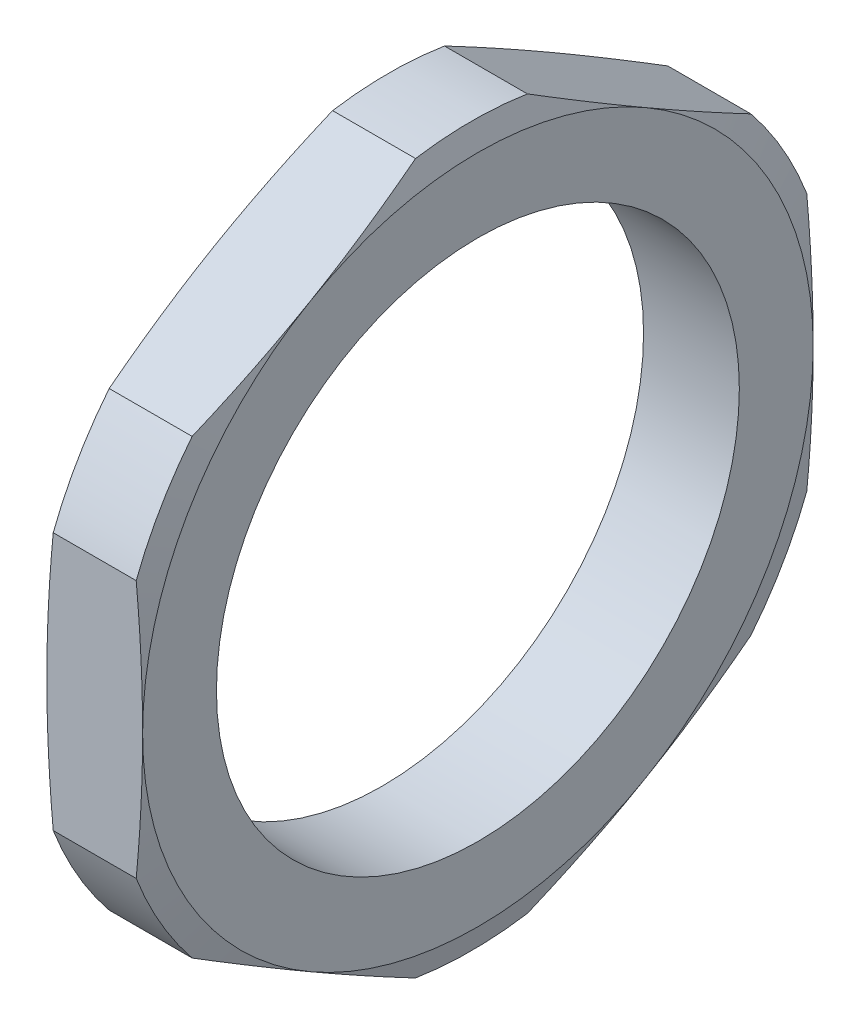
ISO-10303-21;
HEADER;
FILE_DESCRIPTION(('STEP AP214'),'2;1');
FILE_NAME('part.step','',(''),(''),'','','');
FILE_SCHEMA(('AUTOMOTIVE_DESIGN { 1 0 10303 214 1 1 1 1 }'));
ENDSEC;
DATA;
#1=APPLICATION_CONTEXT('core data for automotive mechanical design processes');
#2=APPLICATION_PROTOCOL_DEFINITION('international standard','automotive_design',2000,#1);
#3=PRODUCT_CONTEXT('',#1,'mechanical');
#4=PRODUCT('Part','Part','',(#3));
#5=PRODUCT_RELATED_PRODUCT_CATEGORY('part','',(#4));
#6=PRODUCT_DEFINITION_FORMATION('','',#4);
#7=PRODUCT_DEFINITION_CONTEXT('part definition',#1,'design');
#8=PRODUCT_DEFINITION('design','',#6,#7);
#9=PRODUCT_DEFINITION_SHAPE('','',#8);
#10=(LENGTH_UNIT() NAMED_UNIT(*) SI_UNIT(.MILLI.,.METRE.));
#11=(NAMED_UNIT(*) PLANE_ANGLE_UNIT() SI_UNIT($,.RADIAN.));
#12=(NAMED_UNIT(*) SI_UNIT($,.STERADIAN.) SOLID_ANGLE_UNIT());
#13=UNCERTAINTY_MEASURE_WITH_UNIT(LENGTH_MEASURE(1.E-05),#10,'distance_accuracy_value','');
#14=(GEOMETRIC_REPRESENTATION_CONTEXT(3) GLOBAL_UNCERTAINTY_ASSIGNED_CONTEXT((#13)) GLOBAL_UNIT_ASSIGNED_CONTEXT((#10,
#11,#12)) REPRESENTATION_CONTEXT('',''));
#15=CARTESIAN_POINT('',(0.,0.,0.));
#16=DIRECTION('',(0.,0.,1.));
#17=DIRECTION('',(1.,0.,0.));
#18=AXIS2_PLACEMENT_3D('',#15,#16,#17);
#19=CARTESIAN_POINT('',(17.5,0.,0.));
#20=DIRECTION('',(1.,0.,0.));
#21=DIRECTION('',(0.,0.,-1.));
#22=AXIS2_PLACEMENT_3D('',#19,#20,#21);
#23=CYLINDRICAL_SURFACE('',#22,7.5);
#24=DIRECTION('',(-1.,0.,0.));
#25=VECTOR('',#24,1.);
#26=CARTESIAN_POINT('',(20.5,7.40846902827469,1.16815523672779));
#27=LINE('',#26,#25);
#28=CARTESIAN_POINT('',(19.3660254037845,7.4084690282747,1.16815523672779));
#29=VERTEX_POINT('',#28);
#30=CARTESIAN_POINT('',(17.6339745962156,7.4084690282747,1.16815523672779));
#31=VERTEX_POINT('',#30);
#32=EDGE_CURVE('E42',#29,#31,#27,.T.);
#33=ORIENTED_EDGE('',*,*,#32,.F.);
#34=CARTESIAN_POINT('',(19.3660254037845,0.,0.));
#35=DIRECTION('',(-1.,0.,0.));
#36=DIRECTION('',(0.,0.,1.));
#37=AXIS2_PLACEMENT_3D('',#34,#35,#36);
#38=CIRCLE('',#37,7.5);
#39=CARTESIAN_POINT('',(19.3660254037845,7.40846902827469,-1.16815523672783));
#40=VERTEX_POINT('',#39);
#41=EDGE_CURVE('E11',#29,#40,#38,.T.);
#42=ORIENTED_EDGE('',*,*,#41,.T.);
#43=DIRECTION('',(-1.,0.,0.));
#44=VECTOR('',#43,1.);
#45=CARTESIAN_POINT('',(20.5,7.40846902827469,-1.16815523672783));
#46=LINE('',#45,#44);
#47=CARTESIAN_POINT('',(17.6339745962155,7.40846902827469,-1.16815523672783));
#48=VERTEX_POINT('',#47);
#49=EDGE_CURVE('E29',#40,#48,#46,.T.);
#50=ORIENTED_EDGE('',*,*,#49,.T.);
#51=CARTESIAN_POINT('',(17.6339745962156,0.,0.));
#52=DIRECTION('',(-1.,0.,0.));
#53=DIRECTION('',(0.,0.,1.));
#54=AXIS2_PLACEMENT_3D('',#51,#52,#53);
#55=CIRCLE('',#54,7.5);
#56=EDGE_CURVE('E123',#31,#48,#55,.T.);
#57=ORIENTED_EDGE('',*,*,#56,.F.);
#58=EDGE_LOOP('',(#33,#42,#50,#57));
#59=FACE_BOUND('',#58,.T.);
#60=ADVANCED_FACE('F16',(#59),#23,.T.);
#61=CARTESIAN_POINT('',(17.5,0.,0.));
#62=DIRECTION('',(1.,0.,0.));
#63=DIRECTION('',(0.,0.,-1.));
#64=AXIS2_PLACEMENT_3D('',#61,#62,#63);
#65=CYLINDRICAL_SURFACE('',#64,7.5);
#66=DIRECTION('',(-1.,0.,0.));
#67=VECTOR('',#66,1.);
#68=CARTESIAN_POINT('',(20.5,4.71588662470743,-5.83184476327221));
#69=LINE('',#68,#67);
#70=CARTESIAN_POINT('',(19.3660254037845,4.71588662470743,-5.83184476327221));
#71=VERTEX_POINT('',#70);
#72=CARTESIAN_POINT('',(17.6339745962156,4.71588662470743,-5.83184476327222));
#73=VERTEX_POINT('',#72);
#74=EDGE_CURVE('E136',#71,#73,#69,.T.);
#75=ORIENTED_EDGE('',*,*,#74,.F.);
#76=CARTESIAN_POINT('',(19.3660254037845,0.,0.));
#77=DIRECTION('',(-1.,0.,0.));
#78=DIRECTION('',(0.,0.,1.));
#79=AXIS2_PLACEMENT_3D('',#76,#77,#78);
#80=CIRCLE('',#79,7.5);
#81=CARTESIAN_POINT('',(19.3660254037845,2.69258240356722,-7.));
#82=VERTEX_POINT('',#81);
#83=EDGE_CURVE('E1076',#71,#82,#80,.T.);
#84=ORIENTED_EDGE('',*,*,#83,.T.);
#85=DIRECTION('',(-1.,0.,0.));
#86=VECTOR('',#85,1.);
#87=CARTESIAN_POINT('',(20.5,2.69258240356722,-7.));
#88=LINE('',#87,#86);
#89=CARTESIAN_POINT('',(17.6339745962156,2.69258240356722,-7.));
#90=VERTEX_POINT('',#89);
#91=EDGE_CURVE('E492',#82,#90,#88,.T.);
#92=ORIENTED_EDGE('',*,*,#91,.T.);
#93=CARTESIAN_POINT('',(17.6339745962156,0.,0.));
#94=DIRECTION('',(-1.,0.,0.));
#95=DIRECTION('',(0.,0.,1.));
#96=AXIS2_PLACEMENT_3D('',#93,#94,#95);
#97=CIRCLE('',#96,7.5);
#98=EDGE_CURVE('E671',#73,#90,#97,.T.);
#99=ORIENTED_EDGE('',*,*,#98,.F.);
#100=EDGE_LOOP('',(#75,#84,#92,#99));
#101=FACE_BOUND('',#100,.T.);
#102=ADVANCED_FACE('F18',(#101),#65,.T.);
#103=CARTESIAN_POINT('',(17.5,0.,0.));
#104=DIRECTION('',(1.,0.,0.));
#105=DIRECTION('',(0.,0.,-1.));
#106=AXIS2_PLACEMENT_3D('',#103,#104,#105);
#107=CYLINDRICAL_SURFACE('',#106,7.5);
#108=DIRECTION('',(-1.,0.,0.));
#109=VECTOR('',#108,1.);
#110=CARTESIAN_POINT('',(20.5,-2.69258240356726,-7.));
#111=LINE('',#110,#109);
#112=CARTESIAN_POINT('',(19.3660254037845,-2.69258240356727,-7.));
#113=VERTEX_POINT('',#112);
#114=CARTESIAN_POINT('',(17.6339745962156,-2.69258240356727,-7.));
#115=VERTEX_POINT('',#114);
#116=EDGE_CURVE('E556',#113,#115,#111,.T.);
#117=ORIENTED_EDGE('',*,*,#116,.F.);
#118=CARTESIAN_POINT('',(19.3660254037845,0.,0.));
#119=DIRECTION('',(-1.,0.,0.));
#120=DIRECTION('',(0.,0.,1.));
#121=AXIS2_PLACEMENT_3D('',#118,#119,#120);
#122=CIRCLE('',#121,7.5);
#123=CARTESIAN_POINT('',(19.3660254037845,-4.71588662470747,-5.83184476327218));
#124=VERTEX_POINT('',#123);
#125=EDGE_CURVE('E488',#113,#124,#122,.T.);
#126=ORIENTED_EDGE('',*,*,#125,.T.);
#127=DIRECTION('',(-1.,0.,0.));
#128=VECTOR('',#127,1.);
#129=CARTESIAN_POINT('',(20.5,-4.71588662470747,-5.83184476327218));
#130=LINE('',#129,#128);
#131=CARTESIAN_POINT('',(17.6339745962156,-4.71588662470747,-5.83184476327218));
#132=VERTEX_POINT('',#131);
#133=EDGE_CURVE('E389',#124,#132,#130,.T.);
#134=ORIENTED_EDGE('',*,*,#133,.T.);
#135=CARTESIAN_POINT('',(17.6339745962156,0.,0.));
#136=DIRECTION('',(-1.,0.,0.));
#137=DIRECTION('',(0.,0.,1.));
#138=AXIS2_PLACEMENT_3D('',#135,#136,#137);
#139=CIRCLE('',#138,7.5);
#140=EDGE_CURVE('E677',#115,#132,#139,.T.);
#141=ORIENTED_EDGE('',*,*,#140,.F.);
#142=EDGE_LOOP('',(#117,#126,#134,#141));
#143=FACE_BOUND('',#142,.T.);
#144=ADVANCED_FACE('F743',(#143),#107,.T.);
#145=CARTESIAN_POINT('',(17.5,0.,0.));
#146=DIRECTION('',(1.,0.,0.));
#147=DIRECTION('',(0.,0.,-1.));
#148=AXIS2_PLACEMENT_3D('',#145,#146,#147);
#149=CYLINDRICAL_SURFACE('',#148,7.5);
#150=DIRECTION('',(-1.,0.,0.));
#151=VECTOR('',#150,1.);
#152=CARTESIAN_POINT('',(20.5,-7.4084690282747,-1.16815523672779));
#153=LINE('',#152,#151);
#154=CARTESIAN_POINT('',(19.3660254037845,-7.4084690282747,-1.16815523672779));
#155=VERTEX_POINT('',#154);
#156=CARTESIAN_POINT('',(17.6339745962156,-7.4084690282747,-1.16815523672779));
#157=VERTEX_POINT('',#156);
#158=EDGE_CURVE('E422',#155,#157,#153,.T.);
#159=ORIENTED_EDGE('',*,*,#158,.F.);
#160=CARTESIAN_POINT('',(19.3660254037845,0.,0.));
#161=DIRECTION('',(-1.,0.,0.));
#162=DIRECTION('',(0.,0.,1.));
#163=AXIS2_PLACEMENT_3D('',#160,#161,#162);
#164=CIRCLE('',#163,7.5);
#165=CARTESIAN_POINT('',(19.3660254037845,-7.40846902827469,1.16815523672783));
#166=VERTEX_POINT('',#165);
#167=EDGE_CURVE('E385',#155,#166,#164,.T.);
#168=ORIENTED_EDGE('',*,*,#167,.T.);
#169=DIRECTION('',(-1.,0.,0.));
#170=VECTOR('',#169,1.);
#171=CARTESIAN_POINT('',(20.5,-7.40846902827469,1.16815523672782));
#172=LINE('',#171,#170);
#173=CARTESIAN_POINT('',(17.6339745962156,-7.40846902827469,1.16815523672783));
#174=VERTEX_POINT('',#173);
#175=EDGE_CURVE('E390',#166,#174,#172,.T.);
#176=ORIENTED_EDGE('',*,*,#175,.T.);
#177=CARTESIAN_POINT('',(17.6339745962156,0.,0.));
#178=DIRECTION('',(-1.,0.,0.));
#179=DIRECTION('',(0.,0.,1.));
#180=AXIS2_PLACEMENT_3D('',#177,#178,#179);
#181=CIRCLE('',#180,7.5);
#182=EDGE_CURVE('E684',#157,#174,#181,.T.);
#183=ORIENTED_EDGE('',*,*,#182,.F.);
#184=EDGE_LOOP('',(#159,#168,#176,#183));
#185=FACE_BOUND('',#184,.T.);
#186=ADVANCED_FACE('F749',(#185),#149,.T.);
#187=CARTESIAN_POINT('',(17.5,0.,0.));
#188=DIRECTION('',(1.,0.,0.));
#189=DIRECTION('',(0.,0.,-1.));
#190=AXIS2_PLACEMENT_3D('',#187,#188,#189);
#191=CYLINDRICAL_SURFACE('',#190,7.5);
#192=DIRECTION('',(-1.,0.,0.));
#193=VECTOR('',#192,1.);
#194=CARTESIAN_POINT('',(20.5,-4.71588662470744,5.83184476327221));
#195=LINE('',#194,#193);
#196=CARTESIAN_POINT('',(19.3660254037845,-4.71588662470744,5.83184476327221));
#197=VERTEX_POINT('',#196);
#198=CARTESIAN_POINT('',(17.6339745962156,-4.71588662470744,5.83184476327221));
#199=VERTEX_POINT('',#198);
#200=EDGE_CURVE('E316',#197,#199,#195,.T.);
#201=ORIENTED_EDGE('',*,*,#200,.F.);
#202=CARTESIAN_POINT('',(19.3660254037845,0.,0.));
#203=DIRECTION('',(-1.,0.,0.));
#204=DIRECTION('',(0.,0.,1.));
#205=AXIS2_PLACEMENT_3D('',#202,#203,#204);
#206=CIRCLE('',#205,7.5);
#207=CARTESIAN_POINT('',(19.3660254037845,-2.69258240356722,7.));
#208=VERTEX_POINT('',#207);
#209=EDGE_CURVE('E396',#197,#208,#206,.T.);
#210=ORIENTED_EDGE('',*,*,#209,.T.);
#211=DIRECTION('',(-1.,0.,0.));
#212=VECTOR('',#211,1.);
#213=CARTESIAN_POINT('',(20.5,-2.69258240356723,7.));
#214=LINE('',#213,#212);
#215=CARTESIAN_POINT('',(17.6339745962156,-2.69258240356722,7.));
#216=VERTEX_POINT('',#215);
#217=EDGE_CURVE('E1100',#208,#216,#214,.T.);
#218=ORIENTED_EDGE('',*,*,#217,.T.);
#219=CARTESIAN_POINT('',(17.6339745962156,0.,0.));
#220=DIRECTION('',(-1.,0.,0.));
#221=DIRECTION('',(0.,0.,1.));
#222=AXIS2_PLACEMENT_3D('',#219,#220,#221);
#223=CIRCLE('',#222,7.5);
#224=EDGE_CURVE('E207',#199,#216,#223,.T.);
#225=ORIENTED_EDGE('',*,*,#224,.F.);
#226=EDGE_LOOP('',(#201,#210,#218,#225));
#227=FACE_BOUND('',#226,.T.);
#228=ADVANCED_FACE('F456',(#227),#191,.T.);
#229=CARTESIAN_POINT('',(17.5,0.,0.));
#230=DIRECTION('',(1.,0.,0.));
#231=DIRECTION('',(0.,0.,-1.));
#232=AXIS2_PLACEMENT_3D('',#229,#230,#231);
#233=CYLINDRICAL_SURFACE('',#232,7.5);
#234=DIRECTION('',(-1.,0.,0.));
#235=VECTOR('',#234,1.);
#236=CARTESIAN_POINT('',(20.5,2.69258240356726,7.));
#237=LINE('',#236,#235);
#238=CARTESIAN_POINT('',(19.3660254037845,2.69258240356726,7.));
#239=VERTEX_POINT('',#238);
#240=CARTESIAN_POINT('',(17.6339745962156,2.69258240356726,7.));
#241=VERTEX_POINT('',#240);
#242=EDGE_CURVE('E1066',#239,#241,#237,.T.);
#243=ORIENTED_EDGE('',*,*,#242,.F.);
#244=CARTESIAN_POINT('',(19.3660254037845,0.,0.));
#245=DIRECTION('',(-1.,0.,0.));
#246=DIRECTION('',(0.,0.,1.));
#247=AXIS2_PLACEMENT_3D('',#244,#245,#246);
#248=CIRCLE('',#247,7.5);
#249=CARTESIAN_POINT('',(19.3660254037845,4.71588662470747,5.83184476327219));
#250=VERTEX_POINT('',#249);
#251=EDGE_CURVE('E214',#239,#250,#248,.T.);
#252=ORIENTED_EDGE('',*,*,#251,.T.);
#253=DIRECTION('',(-1.,0.,0.));
#254=VECTOR('',#253,1.);
#255=CARTESIAN_POINT('',(20.5,4.71588662470746,5.83184476327219));
#256=LINE('',#255,#254);
#257=CARTESIAN_POINT('',(17.6339745962156,4.71588662470747,5.83184476327219));
#258=VERTEX_POINT('',#257);
#259=EDGE_CURVE('E211',#250,#258,#256,.T.);
#260=ORIENTED_EDGE('',*,*,#259,.T.);
#261=CARTESIAN_POINT('',(17.6339745962156,0.,0.));
#262=DIRECTION('',(-1.,0.,0.));
#263=DIRECTION('',(0.,0.,1.));
#264=AXIS2_PLACEMENT_3D('',#261,#262,#263);
#265=CIRCLE('',#264,7.5);
#266=EDGE_CURVE('E193',#241,#258,#265,.T.);
#267=ORIENTED_EDGE('',*,*,#266,.F.);
#268=EDGE_LOOP('',(#243,#252,#260,#267));
#269=FACE_BOUND('',#268,.T.);
#270=ADVANCED_FACE('F212',(#269),#233,.T.);
#271=CARTESIAN_POINT('',(20.5,4.71588662470747,5.83184476327219));
#272=DIRECTION('',(0.,0.86602540378444,0.5));
#273=DIRECTION('',(1.,0.,0.));
#274=AXIS2_PLACEMENT_3D('',#271,#272,#273);
#275=PLANE('',#274);
#276=ORIENTED_EDGE('',*,*,#259,.F.);
#277=CARTESIAN_POINT('',(19.3660254037845,4.71588662470747,5.83184476327218));
#278=CARTESIAN_POINT('',(19.5,5.41224414287113,4.62571816158015));
#279=CARTESIAN_POINT('',(19.5,6.06217782649109,3.49999999999999));
#280=B_SPLINE_CURVE_WITH_KNOTS('',2,(#277,#278,#279),.UNSPECIFIED.,.F.,.F.,(3,3),(0.,1.),.UNSPECIFIED.);
#281=CARTESIAN_POINT('',(19.5,6.06217782649108,3.5));
#282=VERTEX_POINT('',#281);
#283=EDGE_CURVE('E219',#250,#282,#280,.T.);
#284=ORIENTED_EDGE('',*,*,#283,.T.);
#285=CARTESIAN_POINT('',(19.5,6.06217782649109,3.49999999999999));
#286=CARTESIAN_POINT('',(19.5,6.71211151011105,2.37428183841982));
#287=CARTESIAN_POINT('',(19.3660254037845,7.40846902827472,1.16815523672779));
#288=B_SPLINE_CURVE_WITH_KNOTS('',2,(#285,#286,#287),.UNSPECIFIED.,.F.,.F.,(3,3),(0.,1.),.UNSPECIFIED.);
#289=EDGE_CURVE('E1115',#282,#29,#288,.T.);
#290=ORIENTED_EDGE('',*,*,#289,.T.);
#291=ORIENTED_EDGE('',*,*,#32,.T.);
#292=CARTESIAN_POINT('',(17.6339745962155,7.40846902827472,1.16815523672779));
#293=CARTESIAN_POINT('',(17.5,6.71211151011104,2.37428183841984));
#294=CARTESIAN_POINT('',(17.5,6.06217782649109,3.49999999999999));
#295=B_SPLINE_CURVE_WITH_KNOTS('',2,(#292,#293,#294),.UNSPECIFIED.,.F.,.F.,(3,3),(0.,1.),.UNSPECIFIED.);
#296=CARTESIAN_POINT('',(17.5,6.06217782649108,3.5));
#297=VERTEX_POINT('',#296);
#298=EDGE_CURVE('E224',#31,#297,#295,.T.);
#299=ORIENTED_EDGE('',*,*,#298,.T.);
#300=CARTESIAN_POINT('',(17.5,6.06217782649109,3.49999999999999));
#301=CARTESIAN_POINT('',(17.5,5.41224414287114,4.62571816158014));
#302=CARTESIAN_POINT('',(17.6339745962155,4.71588662470747,5.83184476327218));
#303=B_SPLINE_CURVE_WITH_KNOTS('',2,(#300,#301,#302),.UNSPECIFIED.,.F.,.F.,(3,3),(0.,1.),.UNSPECIFIED.);
#304=EDGE_CURVE('E198',#297,#258,#303,.T.);
#305=ORIENTED_EDGE('',*,*,#304,.T.);
#306=EDGE_LOOP('',(#276,#284,#290,#291,#299,#305));
#307=FACE_BOUND('',#306,.T.);
#308=ADVANCED_FACE('F222',(#307),#275,.T.);
#309=CARTESIAN_POINT('',(20.5,-2.69258240356723,7.));
#310=DIRECTION('',(0.,0.,1.));
#311=DIRECTION('',(1.,0.,0.));
#312=AXIS2_PLACEMENT_3D('',#309,#310,#311);
#313=PLANE('',#312);
#314=ORIENTED_EDGE('',*,*,#217,.F.);
#315=CARTESIAN_POINT('',(19.3660254037845,-2.69258240356722,7.));
#316=CARTESIAN_POINT('',(19.5,-1.29986736723862,7.));
#317=CARTESIAN_POINT('',(19.5,0.,6.99999999999999));
#318=B_SPLINE_CURVE_WITH_KNOTS('',2,(#315,#316,#317),.UNSPECIFIED.,.F.,.F.,(3,3),(0.,1.),.UNSPECIFIED.);
#319=CARTESIAN_POINT('',(19.5,0.,7.));
#320=VERTEX_POINT('',#319);
#321=EDGE_CURVE('E228',#208,#320,#318,.T.);
#322=ORIENTED_EDGE('',*,*,#321,.T.);
#323=CARTESIAN_POINT('',(19.5,0.,6.99999999999999));
#324=CARTESIAN_POINT('',(19.5,1.29986736723964,6.99999999999999));
#325=CARTESIAN_POINT('',(19.3660254037845,2.69258240356726,6.99999999999999));
#326=B_SPLINE_CURVE_WITH_KNOTS('',2,(#323,#324,#325),.UNSPECIFIED.,.F.,.F.,(3,3),(0.,1.),.UNSPECIFIED.);
#327=EDGE_CURVE('E1058',#320,#239,#326,.T.);
#328=ORIENTED_EDGE('',*,*,#327,.T.);
#329=ORIENTED_EDGE('',*,*,#242,.T.);
#330=CARTESIAN_POINT('',(17.6339745962156,2.69258240356726,6.99999999999999));
#331=CARTESIAN_POINT('',(17.5,1.29986736723918,6.99999999999999));
#332=CARTESIAN_POINT('',(17.5,0.,6.99999999999999));
#333=B_SPLINE_CURVE_WITH_KNOTS('',2,(#330,#331,#332),.UNSPECIFIED.,.F.,.F.,(3,3),(0.,1.),.UNSPECIFIED.);
#334=CARTESIAN_POINT('',(17.5,0.,7.));
#335=VERTEX_POINT('',#334);
#336=EDGE_CURVE('E202',#241,#335,#333,.T.);
#337=ORIENTED_EDGE('',*,*,#336,.T.);
#338=CARTESIAN_POINT('',(17.5,0.,6.99999999999999));
#339=CARTESIAN_POINT('',(17.5,-1.29986736723932,7.));
#340=CARTESIAN_POINT('',(17.6339745962156,-2.69258240356722,7.));
#341=B_SPLINE_CURVE_WITH_KNOTS('',2,(#338,#339,#340),.UNSPECIFIED.,.F.,.F.,(3,3),(0.,1.),.UNSPECIFIED.);
#342=EDGE_CURVE('E1008',#335,#216,#341,.T.);
#343=ORIENTED_EDGE('',*,*,#342,.T.);
#344=EDGE_LOOP('',(#314,#322,#328,#329,#337,#343));
#345=FACE_BOUND('',#344,.T.);
#346=ADVANCED_FACE('F246',(#345),#313,.T.);
#347=CARTESIAN_POINT('',(20.5,-7.40846902827469,1.16815523672782));
#348=DIRECTION('',(0.,-0.866025403784438,0.5));
#349=DIRECTION('',(-1.,0.,0.));
#350=AXIS2_PLACEMENT_3D('',#347,#348,#349);
#351=PLANE('',#350);
#352=ORIENTED_EDGE('',*,*,#175,.F.);
#353=CARTESIAN_POINT('',(19.3660254037845,-7.40846902827469,1.16815523672783));
#354=CARTESIAN_POINT('',(19.5,-6.71211151011102,2.37428183841986));
#355=CARTESIAN_POINT('',(19.5,-6.06217782649107,3.50000000000002));
#356=B_SPLINE_CURVE_WITH_KNOTS('',2,(#353,#354,#355),.UNSPECIFIED.,.F.,.F.,(3,3),(0.,1.),.UNSPECIFIED.);
#357=CARTESIAN_POINT('',(19.5,-6.06217782649106,3.5));
#358=VERTEX_POINT('',#357);
#359=EDGE_CURVE('E1039',#166,#358,#356,.T.);
#360=ORIENTED_EDGE('',*,*,#359,.T.);
#361=CARTESIAN_POINT('',(19.5,-6.06217782649107,3.50000000000002));
#362=CARTESIAN_POINT('',(19.5,-5.4122441428711,4.62571816158019));
#363=CARTESIAN_POINT('',(19.3660254037845,-4.71588662470744,5.83184476327221));
#364=B_SPLINE_CURVE_WITH_KNOTS('',2,(#361,#362,#363),.UNSPECIFIED.,.F.,.F.,(3,3),(0.,1.),.UNSPECIFIED.);
#365=EDGE_CURVE('E325',#358,#197,#364,.T.);
#366=ORIENTED_EDGE('',*,*,#365,.T.);
#367=ORIENTED_EDGE('',*,*,#200,.T.);
#368=CARTESIAN_POINT('',(17.6339745962155,-4.71588662470744,5.83184476327221));
#369=CARTESIAN_POINT('',(17.5,-5.41224414287111,4.62571816158017));
#370=CARTESIAN_POINT('',(17.5,-6.06217782649107,3.50000000000002));
#371=B_SPLINE_CURVE_WITH_KNOTS('',2,(#368,#369,#370),.UNSPECIFIED.,.F.,.F.,(3,3),(0.,1.),.UNSPECIFIED.);
#372=CARTESIAN_POINT('',(17.5,-6.06217782649107,3.5));
#373=VERTEX_POINT('',#372);
#374=EDGE_CURVE('E326',#199,#373,#371,.T.);
#375=ORIENTED_EDGE('',*,*,#374,.T.);
#376=CARTESIAN_POINT('',(17.5,-6.06217782649107,3.50000000000002));
#377=CARTESIAN_POINT('',(17.5,-6.71211151011102,2.37428183841986));
#378=CARTESIAN_POINT('',(17.6339745962155,-7.40846902827469,1.16815523672783));
#379=B_SPLINE_CURVE_WITH_KNOTS('',2,(#376,#377,#378),.UNSPECIFIED.,.F.,.F.,(3,3),(0.,1.),.UNSPECIFIED.);
#380=EDGE_CURVE('E513',#373,#174,#379,.T.);
#381=ORIENTED_EDGE('',*,*,#380,.T.);
#382=EDGE_LOOP('',(#352,#360,#366,#367,#375,#381));
#383=FACE_BOUND('',#382,.T.);
#384=ADVANCED_FACE('F340',(#383),#351,.T.);
#385=CARTESIAN_POINT('',(20.5,-4.71588662470747,-5.83184476327219));
#386=DIRECTION('',(0.,-0.86602540378444,-0.5));
#387=DIRECTION('',(0.,0.5,-0.86602540378444));
#388=AXIS2_PLACEMENT_3D('',#385,#386,#387);
#389=PLANE('',#388);
#390=ORIENTED_EDGE('',*,*,#133,.F.);
#391=CARTESIAN_POINT('',(19.3660254037845,-4.71588662470747,-5.83184476327218));
#392=CARTESIAN_POINT('',(19.5,-5.41224414287113,-4.62571816158015));
#393=CARTESIAN_POINT('',(19.5,-6.06217782649109,-3.49999999999998));
#394=B_SPLINE_CURVE_WITH_KNOTS('',2,(#391,#392,#393),.UNSPECIFIED.,.F.,.F.,(3,3),(0.,1.),.UNSPECIFIED.);
#395=CARTESIAN_POINT('',(19.5,-6.06217782649109,-3.5));
#396=VERTEX_POINT('',#395);
#397=EDGE_CURVE('E508',#124,#396,#394,.T.);
#398=ORIENTED_EDGE('',*,*,#397,.T.);
#399=CARTESIAN_POINT('',(19.5,-6.06217782649109,-3.49999999999998));
#400=CARTESIAN_POINT('',(19.5,-6.71211151011106,-2.37428183841981));
#401=CARTESIAN_POINT('',(19.3660254037845,-7.40846902827472,-1.16815523672779));
#402=B_SPLINE_CURVE_WITH_KNOTS('',2,(#399,#400,#401),.UNSPECIFIED.,.F.,.F.,(3,3),(0.,1.),.UNSPECIFIED.);
#403=EDGE_CURVE('E431',#396,#155,#402,.T.);
#404=ORIENTED_EDGE('',*,*,#403,.T.);
#405=ORIENTED_EDGE('',*,*,#158,.T.);
#406=CARTESIAN_POINT('',(17.6339745962155,-7.40846902827472,-1.16815523672779));
#407=CARTESIAN_POINT('',(17.5,-6.71211151011105,-2.37428183841983));
#408=CARTESIAN_POINT('',(17.5,-6.06217782649109,-3.49999999999998));
#409=B_SPLINE_CURVE_WITH_KNOTS('',2,(#406,#407,#408),.UNSPECIFIED.,.F.,.F.,(3,3),(0.,1.),.UNSPECIFIED.);
#410=CARTESIAN_POINT('',(17.5,-6.06217782649109,-3.5));
#411=VERTEX_POINT('',#410);
#412=EDGE_CURVE('E432',#157,#411,#409,.T.);
#413=ORIENTED_EDGE('',*,*,#412,.T.);
#414=CARTESIAN_POINT('',(17.5,-6.06217782649109,-3.49999999999998));
#415=CARTESIAN_POINT('',(17.5,-5.41224414287115,-4.62571816158013));
#416=CARTESIAN_POINT('',(17.6339745962155,-4.71588662470747,-5.83184476327218));
#417=B_SPLINE_CURVE_WITH_KNOTS('',2,(#414,#415,#416),.UNSPECIFIED.,.F.,.F.,(3,3),(0.,1.),.UNSPECIFIED.);
#418=EDGE_CURVE('E534',#411,#132,#417,.T.);
#419=ORIENTED_EDGE('',*,*,#418,.T.);
#420=EDGE_LOOP('',(#390,#398,#404,#405,#413,#419));
#421=FACE_BOUND('',#420,.T.);
#422=ADVANCED_FACE('F349',(#421),#389,.T.);
#423=CARTESIAN_POINT('',(20.5,2.69258240356722,-7.));
#424=DIRECTION('',(0.,0.,-1.));
#425=DIRECTION('',(0.,-1.,0.));
#426=AXIS2_PLACEMENT_3D('',#423,#424,#425);
#427=PLANE('',#426);
#428=ORIENTED_EDGE('',*,*,#91,.F.);
#429=CARTESIAN_POINT('',(19.3660254037845,2.69258240356722,-7.));
#430=CARTESIAN_POINT('',(19.5,1.29986736723944,-7.));
#431=CARTESIAN_POINT('',(19.5,0.,-6.99999999999999));
#432=B_SPLINE_CURVE_WITH_KNOTS('',2,(#429,#430,#431),.UNSPECIFIED.,.F.,.F.,(3,3),(0.,1.),.UNSPECIFIED.);
#433=CARTESIAN_POINT('',(19.5,0.,-7.));
#434=VERTEX_POINT('',#433);
#435=EDGE_CURVE('E541',#82,#434,#432,.T.);
#436=ORIENTED_EDGE('',*,*,#435,.T.);
#437=CARTESIAN_POINT('',(19.5,0.,-6.99999999999999));
#438=CARTESIAN_POINT('',(19.5,-1.29986736723874,-6.99999999999999));
#439=CARTESIAN_POINT('',(19.3660254037845,-2.69258240356727,-6.99999999999998));
#440=B_SPLINE_CURVE_WITH_KNOTS('',2,(#437,#438,#439),.UNSPECIFIED.,.F.,.F.,(3,3),(0.,1.),.UNSPECIFIED.);
#441=EDGE_CURVE('E549',#434,#113,#440,.T.);
#442=ORIENTED_EDGE('',*,*,#441,.T.);
#443=ORIENTED_EDGE('',*,*,#116,.T.);
#444=CARTESIAN_POINT('',(17.6339745962156,-2.69258240356727,-6.99999999999998));
#445=CARTESIAN_POINT('',(17.5,-1.29986736723932,-6.99999999999999));
#446=CARTESIAN_POINT('',(17.5,0.,-6.99999999999999));
#447=B_SPLINE_CURVE_WITH_KNOTS('',2,(#444,#445,#446),.UNSPECIFIED.,.F.,.F.,(3,3),(0.,1.),.UNSPECIFIED.);
#448=CARTESIAN_POINT('',(17.5,0.,-7.));
#449=VERTEX_POINT('',#448);
#450=EDGE_CURVE('E564',#115,#449,#447,.T.);
#451=ORIENTED_EDGE('',*,*,#450,.T.);
#452=CARTESIAN_POINT('',(17.5,0.,-6.99999999999999));
#453=CARTESIAN_POINT('',(17.5,1.29986736724003,-7.));
#454=CARTESIAN_POINT('',(17.6339745962156,2.69258240356722,-7.));
#455=B_SPLINE_CURVE_WITH_KNOTS('',2,(#452,#453,#454),.UNSPECIFIED.,.F.,.F.,(3,3),(0.,1.),.UNSPECIFIED.);
#456=EDGE_CURVE('E573',#449,#90,#455,.T.);
#457=ORIENTED_EDGE('',*,*,#456,.T.);
#458=EDGE_LOOP('',(#428,#436,#442,#443,#451,#457));
#459=FACE_BOUND('',#458,.T.);
#460=ADVANCED_FACE('F455',(#459),#427,.T.);
#461=CARTESIAN_POINT('',(20.5,7.40846902827469,-1.16815523672783));
#462=DIRECTION('',(0.,0.866025403784437,-0.5));
#463=DIRECTION('',(-1.,0.,0.));
#464=AXIS2_PLACEMENT_3D('',#461,#462,#463);
#465=PLANE('',#464);
#466=ORIENTED_EDGE('',*,*,#49,.F.);
#467=CARTESIAN_POINT('',(19.3660254037845,7.40846902827469,-1.16815523672783));
#468=CARTESIAN_POINT('',(19.5,6.71211151011103,-2.37428183841985));
#469=CARTESIAN_POINT('',(19.5,6.06217782649107,-3.50000000000002));
#470=B_SPLINE_CURVE_WITH_KNOTS('',2,(#467,#468,#469),.UNSPECIFIED.,.F.,.F.,(3,3),(0.,1.),.UNSPECIFIED.);
#471=CARTESIAN_POINT('',(19.5,6.06217782649106,-3.5));
#472=VERTEX_POINT('',#471);
#473=EDGE_CURVE('E581',#40,#472,#470,.T.);
#474=ORIENTED_EDGE('',*,*,#473,.T.);
#475=CARTESIAN_POINT('',(19.5,6.06217782649107,-3.50000000000002));
#476=CARTESIAN_POINT('',(19.5,5.41224414287111,-4.62571816158018));
#477=CARTESIAN_POINT('',(19.3660254037845,4.71588662470744,-5.83184476327222));
#478=B_SPLINE_CURVE_WITH_KNOTS('',2,(#475,#476,#477),.UNSPECIFIED.,.F.,.F.,(3,3),(0.,1.),.UNSPECIFIED.);
#479=EDGE_CURVE('E588',#472,#71,#478,.T.);
#480=ORIENTED_EDGE('',*,*,#479,.T.);
#481=ORIENTED_EDGE('',*,*,#74,.T.);
#482=CARTESIAN_POINT('',(17.6339745962155,4.71588662470744,-5.83184476327222));
#483=CARTESIAN_POINT('',(17.5,5.41224414287112,-4.62571816158017));
#484=CARTESIAN_POINT('',(17.5,6.06217782649107,-3.50000000000002));
#485=B_SPLINE_CURVE_WITH_KNOTS('',2,(#482,#483,#484),.UNSPECIFIED.,.F.,.F.,(3,3),(0.,1.),.UNSPECIFIED.);
#486=CARTESIAN_POINT('',(17.5,6.06217782649106,-3.5));
#487=VERTEX_POINT('',#486);
#488=EDGE_CURVE('E598',#73,#487,#485,.T.);
#489=ORIENTED_EDGE('',*,*,#488,.T.);
#490=CARTESIAN_POINT('',(17.5,6.06217782649107,-3.50000000000002));
#491=CARTESIAN_POINT('',(17.5,6.71211151011101,-2.37428183841988));
#492=CARTESIAN_POINT('',(17.6339745962155,7.40846902827469,-1.16815523672783));
#493=B_SPLINE_CURVE_WITH_KNOTS('',2,(#490,#491,#492),.UNSPECIFIED.,.F.,.F.,(3,3),(0.,1.),.UNSPECIFIED.);
#494=EDGE_CURVE('E606',#487,#48,#493,.T.);
#495=ORIENTED_EDGE('',*,*,#494,.T.);
#496=EDGE_LOOP('',(#466,#474,#480,#481,#489,#495));
#497=FACE_BOUND('',#496,.T.);
#498=ADVANCED_FACE('F791',(#497),#465,.T.);
#499=CARTESIAN_POINT('',(17.5,0.,0.));
#500=DIRECTION('',(-1.,0.,0.));
#501=DIRECTION('',(0.,0.,1.));
#502=AXIS2_PLACEMENT_3D('',#499,#500,#501);
#503=PLANE('',#502);
#504=CARTESIAN_POINT('',(17.5,0.,0.));
#505=DIRECTION('',(-1.,0.,0.));
#506=DIRECTION('',(0.,0.,1.));
#507=AXIS2_PLACEMENT_3D('',#504,#505,#506);
#508=CIRCLE('',#507,5.4585);
#509=CARTESIAN_POINT('',(17.5,0.,5.4585));
#510=VERTEX_POINT('',#509);
#511=EDGE_CURVE('E659',#510,#510,#508,.T.);
#512=ORIENTED_EDGE('',*,*,#511,.F.);
#513=EDGE_LOOP('',(#512));
#514=FACE_BOUND('',#513,.T.);
#515=CARTESIAN_POINT('',(17.5,0.,0.));
#516=DIRECTION('',(-1.,0.,0.));
#517=DIRECTION('',(0.,0.,1.));
#518=AXIS2_PLACEMENT_3D('',#515,#516,#517);
#519=CIRCLE('',#518,7.);
#520=EDGE_CURVE('E614',#373,#335,#519,.T.);
#521=ORIENTED_EDGE('',*,*,#520,.T.);
#522=CARTESIAN_POINT('',(17.5,0.,0.));
#523=DIRECTION('',(-1.,0.,0.));
#524=DIRECTION('',(0.,0.,1.));
#525=AXIS2_PLACEMENT_3D('',#522,#523,#524);
#526=CIRCLE('',#525,7.);
#527=EDGE_CURVE('E620',#335,#297,#526,.T.);
#528=ORIENTED_EDGE('',*,*,#527,.T.);
#529=CARTESIAN_POINT('',(17.5,0.,0.));
#530=DIRECTION('',(-1.,0.,0.));
#531=DIRECTION('',(0.,0.,1.));
#532=AXIS2_PLACEMENT_3D('',#529,#530,#531);
#533=CIRCLE('',#532,7.);
#534=EDGE_CURVE('E627',#297,#487,#533,.T.);
#535=ORIENTED_EDGE('',*,*,#534,.T.);
#536=CARTESIAN_POINT('',(17.5,0.,0.));
#537=DIRECTION('',(-1.,0.,0.));
#538=DIRECTION('',(0.,0.,1.));
#539=AXIS2_PLACEMENT_3D('',#536,#537,#538);
#540=CIRCLE('',#539,7.);
#541=EDGE_CURVE('E634',#487,#449,#540,.T.);
#542=ORIENTED_EDGE('',*,*,#541,.T.);
#543=CARTESIAN_POINT('',(17.5,0.,0.));
#544=DIRECTION('',(-1.,0.,0.));
#545=DIRECTION('',(0.,0.,1.));
#546=AXIS2_PLACEMENT_3D('',#543,#544,#545);
#547=CIRCLE('',#546,7.);
#548=EDGE_CURVE('E640',#449,#411,#547,.T.);
#549=ORIENTED_EDGE('',*,*,#548,.T.);
#550=CARTESIAN_POINT('',(17.5,0.,0.));
#551=DIRECTION('',(-1.,0.,0.));
#552=DIRECTION('',(0.,0.,1.));
#553=AXIS2_PLACEMENT_3D('',#550,#551,#552);
#554=CIRCLE('',#553,7.);
#555=EDGE_CURVE('E646',#411,#373,#554,.T.);
#556=ORIENTED_EDGE('',*,*,#555,.T.);
#557=EDGE_LOOP('',(#521,#528,#535,#542,#549,#556));
#558=FACE_BOUND('',#557,.T.);
#559=ADVANCED_FACE('F292',(#514,#558),#503,.T.);
#560=CARTESIAN_POINT('',(19.5,0.,0.));
#561=DIRECTION('',(1.,0.,0.));
#562=DIRECTION('',(0.,1.,0.));
#563=AXIS2_PLACEMENT_3D('',#560,#561,#562);
#564=PLANE('',#563);
#565=CARTESIAN_POINT('',(19.5,0.,0.));
#566=DIRECTION('',(-1.,0.,0.));
#567=DIRECTION('',(0.,0.,1.));
#568=AXIS2_PLACEMENT_3D('',#565,#566,#567);
#569=CIRCLE('',#568,7.);
#570=EDGE_CURVE('E725',#320,#282,#569,.T.);
#571=ORIENTED_EDGE('',*,*,#570,.F.);
#572=CARTESIAN_POINT('',(19.5,0.,0.));
#573=DIRECTION('',(-1.,0.,0.));
#574=DIRECTION('',(0.,0.,1.));
#575=AXIS2_PLACEMENT_3D('',#572,#573,#574);
#576=CIRCLE('',#575,7.);
#577=EDGE_CURVE('E382',#358,#320,#576,.T.);
#578=ORIENTED_EDGE('',*,*,#577,.F.);
#579=CARTESIAN_POINT('',(19.5,0.,0.));
#580=DIRECTION('',(-1.,0.,0.));
#581=DIRECTION('',(0.,0.,1.));
#582=AXIS2_PLACEMENT_3D('',#579,#580,#581);
#583=CIRCLE('',#582,7.);
#584=EDGE_CURVE('E377',#396,#358,#583,.T.);
#585=ORIENTED_EDGE('',*,*,#584,.F.);
#586=CARTESIAN_POINT('',(19.5,0.,0.));
#587=DIRECTION('',(-1.,0.,0.));
#588=DIRECTION('',(0.,0.,1.));
#589=AXIS2_PLACEMENT_3D('',#586,#587,#588);
#590=CIRCLE('',#589,7.);
#591=EDGE_CURVE('E381',#434,#396,#590,.T.);
#592=ORIENTED_EDGE('',*,*,#591,.F.);
#593=CARTESIAN_POINT('',(19.5,0.,0.));
#594=DIRECTION('',(-1.,0.,0.));
#595=DIRECTION('',(0.,0.,1.));
#596=AXIS2_PLACEMENT_3D('',#593,#594,#595);
#597=CIRCLE('',#596,7.);
#598=EDGE_CURVE('E208',#472,#434,#597,.T.);
#599=ORIENTED_EDGE('',*,*,#598,.F.);
#600=CARTESIAN_POINT('',(19.5,0.,0.));
#601=DIRECTION('',(-1.,0.,0.));
#602=DIRECTION('',(0.,0.,1.));
#603=AXIS2_PLACEMENT_3D('',#600,#601,#602);
#604=CIRCLE('',#603,7.);
#605=EDGE_CURVE('E485',#282,#472,#604,.T.);
#606=ORIENTED_EDGE('',*,*,#605,.F.);
#607=EDGE_LOOP('',(#571,#578,#585,#592,#599,#606));
#608=FACE_BOUND('',#607,.T.);
#609=CARTESIAN_POINT('',(19.5,0.,0.));
#610=DIRECTION('',(-1.,0.,0.));
#611=DIRECTION('',(0.,0.,1.));
#612=AXIS2_PLACEMENT_3D('',#609,#610,#611);
#613=CIRCLE('',#612,5.4585);
#614=CARTESIAN_POINT('',(19.5,0.,5.4585));
#615=VERTEX_POINT('',#614);
#616=EDGE_CURVE('E652',#615,#615,#613,.T.);
#617=ORIENTED_EDGE('',*,*,#616,.T.);
#618=EDGE_LOOP('',(#617));
#619=FACE_BOUND('',#618,.T.);
#620=ADVANCED_FACE('F458',(#608,#619),#564,.T.);
#621=CARTESIAN_POINT('',(19.5,0.,0.));
#622=DIRECTION('',(-1.,0.,0.));
#623=DIRECTION('',(0.,0.,1.));
#624=AXIS2_PLACEMENT_3D('',#621,#622,#623);
#625=CYLINDRICAL_SURFACE('',#624,5.4585);
#626=ORIENTED_EDGE('',*,*,#511,.T.);
#627=EDGE_LOOP('',(#626));
#628=FACE_BOUND('',#627,.T.);
#629=ORIENTED_EDGE('',*,*,#616,.F.);
#630=EDGE_LOOP('',(#629));
#631=FACE_BOUND('',#630,.T.);
#632=ADVANCED_FACE('F250',(#628,#631),#625,.F.);
#633=CARTESIAN_POINT('',(17.5,0.,0.));
#634=DIRECTION('',(1.,0.,0.));
#635=DIRECTION('',(0.,0.,-1.));
#636=AXIS2_PLACEMENT_3D('',#633,#634,#635);
#637=CONICAL_SURFACE('',#636,7.,1.3089969375);
#638=ORIENTED_EDGE('',*,*,#56,.T.);
#639=ORIENTED_EDGE('',*,*,#494,.F.);
#640=ORIENTED_EDGE('',*,*,#534,.F.);
#641=ORIENTED_EDGE('',*,*,#298,.F.);
#642=EDGE_LOOP('',(#638,#639,#640,#641));
#643=FACE_BOUND('',#642,.T.);
#644=ADVANCED_FACE('F281',(#643),#637,.T.);
#645=CARTESIAN_POINT('',(17.5,0.,0.));
#646=DIRECTION('',(1.,0.,0.));
#647=DIRECTION('',(0.,0.,-1.));
#648=AXIS2_PLACEMENT_3D('',#645,#646,#647);
#649=CONICAL_SURFACE('',#648,7.,1.3089969375);
#650=ORIENTED_EDGE('',*,*,#541,.F.);
#651=ORIENTED_EDGE('',*,*,#488,.F.);
#652=ORIENTED_EDGE('',*,*,#98,.T.);
#653=ORIENTED_EDGE('',*,*,#456,.F.);
#654=EDGE_LOOP('',(#650,#651,#652,#653));
#655=FACE_BOUND('',#654,.T.);
#656=ADVANCED_FACE('F291',(#655),#649,.T.);
#657=CARTESIAN_POINT('',(17.5,0.,0.));
#658=DIRECTION('',(1.,0.,0.));
#659=DIRECTION('',(0.,0.,-1.));
#660=AXIS2_PLACEMENT_3D('',#657,#658,#659);
#661=CONICAL_SURFACE('',#660,7.,1.3089969375);
#662=ORIENTED_EDGE('',*,*,#548,.F.);
#663=ORIENTED_EDGE('',*,*,#450,.F.);
#664=ORIENTED_EDGE('',*,*,#140,.T.);
#665=ORIENTED_EDGE('',*,*,#418,.F.);
#666=EDGE_LOOP('',(#662,#663,#664,#665));
#667=FACE_BOUND('',#666,.T.);
#668=ADVANCED_FACE('F827',(#667),#661,.T.);
#669=CARTESIAN_POINT('',(17.5,0.,0.));
#670=DIRECTION('',(1.,0.,0.));
#671=DIRECTION('',(0.,0.,-1.));
#672=AXIS2_PLACEMENT_3D('',#669,#670,#671);
#673=CONICAL_SURFACE('',#672,7.,1.3089969375);
#674=ORIENTED_EDGE('',*,*,#555,.F.);
#675=ORIENTED_EDGE('',*,*,#412,.F.);
#676=ORIENTED_EDGE('',*,*,#182,.T.);
#677=ORIENTED_EDGE('',*,*,#380,.F.);
#678=EDGE_LOOP('',(#674,#675,#676,#677));
#679=FACE_BOUND('',#678,.T.);
#680=ADVANCED_FACE('F350',(#679),#673,.T.);
#681=CARTESIAN_POINT('',(17.5,0.,0.));
#682=DIRECTION('',(1.,0.,0.));
#683=DIRECTION('',(0.,0.,-1.));
#684=AXIS2_PLACEMENT_3D('',#681,#682,#683);
#685=CONICAL_SURFACE('',#684,7.,1.3089969375);
#686=ORIENTED_EDGE('',*,*,#520,.F.);
#687=ORIENTED_EDGE('',*,*,#374,.F.);
#688=ORIENTED_EDGE('',*,*,#224,.T.);
#689=ORIENTED_EDGE('',*,*,#342,.F.);
#690=EDGE_LOOP('',(#686,#687,#688,#689));
#691=FACE_BOUND('',#690,.T.);
#692=ADVANCED_FACE('F247',(#691),#685,.T.);
#693=CARTESIAN_POINT('',(17.5,0.,0.));
#694=DIRECTION('',(1.,0.,0.));
#695=DIRECTION('',(0.,0.,-1.));
#696=AXIS2_PLACEMENT_3D('',#693,#694,#695);
#697=CONICAL_SURFACE('',#696,7.,1.3089969375);
#698=ORIENTED_EDGE('',*,*,#527,.F.);
#699=ORIENTED_EDGE('',*,*,#336,.F.);
#700=ORIENTED_EDGE('',*,*,#266,.T.);
#701=ORIENTED_EDGE('',*,*,#304,.F.);
#702=EDGE_LOOP('',(#698,#699,#700,#701));
#703=FACE_BOUND('',#702,.T.);
#704=ADVANCED_FACE('F196',(#703),#697,.T.);
#705=CARTESIAN_POINT('',(19.5,0.,0.));
#706=DIRECTION('',(-1.,0.,0.));
#707=DIRECTION('',(0.,0.,-1.));
#708=AXIS2_PLACEMENT_3D('',#705,#706,#707);
#709=CONICAL_SURFACE('',#708,7.,1.3089969375);
#710=ORIENTED_EDGE('',*,*,#83,.F.);
#711=ORIENTED_EDGE('',*,*,#479,.F.);
#712=ORIENTED_EDGE('',*,*,#598,.T.);
#713=ORIENTED_EDGE('',*,*,#435,.F.);
#714=EDGE_LOOP('',(#710,#711,#712,#713));
#715=FACE_BOUND('',#714,.T.);
#716=ADVANCED_FACE('F301',(#715),#709,.T.);
#717=CARTESIAN_POINT('',(19.5,0.,0.));
#718=DIRECTION('',(-1.,0.,0.));
#719=DIRECTION('',(0.,0.,-1.));
#720=AXIS2_PLACEMENT_3D('',#717,#718,#719);
#721=CONICAL_SURFACE('',#720,7.,1.3089969375);
#722=ORIENTED_EDGE('',*,*,#605,.T.);
#723=ORIENTED_EDGE('',*,*,#473,.F.);
#724=ORIENTED_EDGE('',*,*,#41,.F.);
#725=ORIENTED_EDGE('',*,*,#289,.F.);
#726=EDGE_LOOP('',(#722,#723,#724,#725));
#727=FACE_BOUND('',#726,.T.);
#728=ADVANCED_FACE('F858',(#727),#721,.T.);
#729=CARTESIAN_POINT('',(19.5,0.,0.));
#730=DIRECTION('',(-1.,0.,0.));
#731=DIRECTION('',(0.,0.,-1.));
#732=AXIS2_PLACEMENT_3D('',#729,#730,#731);
#733=CONICAL_SURFACE('',#732,7.,1.3089969375);
#734=ORIENTED_EDGE('',*,*,#125,.F.);
#735=ORIENTED_EDGE('',*,*,#441,.F.);
#736=ORIENTED_EDGE('',*,*,#591,.T.);
#737=ORIENTED_EDGE('',*,*,#397,.F.);
#738=EDGE_LOOP('',(#734,#735,#736,#737));
#739=FACE_BOUND('',#738,.T.);
#740=ADVANCED_FACE('F352',(#739),#733,.T.);
#741=CARTESIAN_POINT('',(19.5,0.,0.));
#742=DIRECTION('',(-1.,0.,0.));
#743=DIRECTION('',(0.,0.,-1.));
#744=AXIS2_PLACEMENT_3D('',#741,#742,#743);
#745=CONICAL_SURFACE('',#744,7.,1.3089969375);
#746=ORIENTED_EDGE('',*,*,#167,.F.);
#747=ORIENTED_EDGE('',*,*,#403,.F.);
#748=ORIENTED_EDGE('',*,*,#584,.T.);
#749=ORIENTED_EDGE('',*,*,#359,.F.);
#750=EDGE_LOOP('',(#746,#747,#748,#749));
#751=FACE_BOUND('',#750,.T.);
#752=ADVANCED_FACE('F299',(#751),#745,.T.);
#753=CARTESIAN_POINT('',(19.5,0.,0.));
#754=DIRECTION('',(-1.,0.,0.));
#755=DIRECTION('',(0.,0.,-1.));
#756=AXIS2_PLACEMENT_3D('',#753,#754,#755);
#757=CONICAL_SURFACE('',#756,7.,1.3089969375);
#758=ORIENTED_EDGE('',*,*,#209,.F.);
#759=ORIENTED_EDGE('',*,*,#365,.F.);
#760=ORIENTED_EDGE('',*,*,#577,.T.);
#761=ORIENTED_EDGE('',*,*,#321,.F.);
#762=EDGE_LOOP('',(#758,#759,#760,#761));
#763=FACE_BOUND('',#762,.T.);
#764=ADVANCED_FACE('F294',(#763),#757,.T.);
#765=CARTESIAN_POINT('',(19.5,0.,0.));
#766=DIRECTION('',(-1.,0.,0.));
#767=DIRECTION('',(0.,0.,-1.));
#768=AXIS2_PLACEMENT_3D('',#765,#766,#767);
#769=CONICAL_SURFACE('',#768,7.,1.3089969375);
#770=ORIENTED_EDGE('',*,*,#251,.F.);
#771=ORIENTED_EDGE('',*,*,#327,.F.);
#772=ORIENTED_EDGE('',*,*,#570,.T.);
#773=ORIENTED_EDGE('',*,*,#283,.F.);
#774=EDGE_LOOP('',(#770,#771,#772,#773));
#775=FACE_BOUND('',#774,.T.);
#776=ADVANCED_FACE('F298',(#775),#769,.T.);
#777=CLOSED_SHELL('',(#60,#102,#144,#186,#228,#270,#308,#346,#384,#422,#460,#498,#559,#620,#632,
#644,#656,#668,#680,#692,#704,#716,#728,#740,#752,#764,#776));
#778=MANIFOLD_SOLID_BREP('B1',#777);
#779=ADVANCED_BREP_SHAPE_REPRESENTATION('',(#18,#778),#14);
#780=SHAPE_DEFINITION_REPRESENTATION(#9,#779);
ENDSEC;
END-ISO-10303-21;
